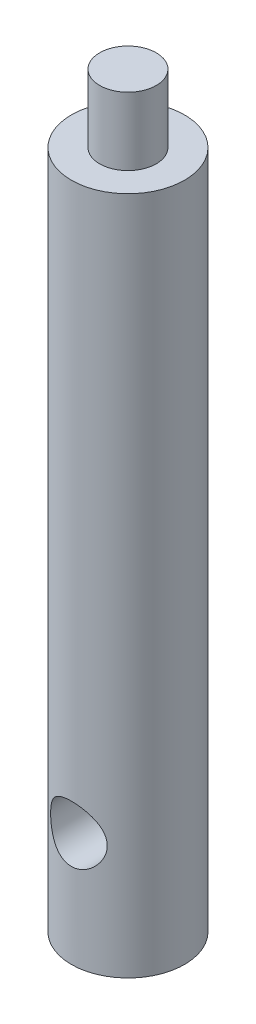
ISO-10303-21;
HEADER;
FILE_DESCRIPTION(('STEP AP214'),'2;1');
FILE_NAME('part.step','',(''),(''),'','','');
FILE_SCHEMA(('AUTOMOTIVE_DESIGN { 1 0 10303 214 1 1 1 1 }'));
ENDSEC;
DATA;
#1=APPLICATION_CONTEXT('core data for automotive mechanical design processes');
#2=APPLICATION_PROTOCOL_DEFINITION('international standard','automotive_design',2000,#1);
#3=PRODUCT_CONTEXT('',#1,'mechanical');
#4=PRODUCT('Part','Part','',(#3));
#5=PRODUCT_RELATED_PRODUCT_CATEGORY('part','',(#4));
#6=PRODUCT_DEFINITION_FORMATION('','',#4);
#7=PRODUCT_DEFINITION_CONTEXT('part definition',#1,'design');
#8=PRODUCT_DEFINITION('design','',#6,#7);
#9=PRODUCT_DEFINITION_SHAPE('','',#8);
#10=(LENGTH_UNIT() NAMED_UNIT(*) SI_UNIT(.MILLI.,.METRE.));
#11=(NAMED_UNIT(*) PLANE_ANGLE_UNIT() SI_UNIT($,.RADIAN.));
#12=(NAMED_UNIT(*) SI_UNIT($,.STERADIAN.) SOLID_ANGLE_UNIT());
#13=UNCERTAINTY_MEASURE_WITH_UNIT(LENGTH_MEASURE(1.E-05),#10,'distance_accuracy_value','');
#14=(GEOMETRIC_REPRESENTATION_CONTEXT(3) GLOBAL_UNCERTAINTY_ASSIGNED_CONTEXT((#13)) GLOBAL_UNIT_ASSIGNED_CONTEXT((#10,
#11,#12)) REPRESENTATION_CONTEXT('',''));
#15=CARTESIAN_POINT('',(0.,0.,0.));
#16=DIRECTION('',(0.,0.,1.));
#17=DIRECTION('',(1.,0.,0.));
#18=AXIS2_PLACEMENT_3D('',#15,#16,#17);
#19=CARTESIAN_POINT('',(0.,66.,0.));
#20=DIRECTION('',(0.,-1.,0.));
#21=DIRECTION('',(0.,0.,-1.));
#22=AXIS2_PLACEMENT_3D('',#19,#20,#21);
#23=PLANE('',#22);
#24=CARTESIAN_POINT('',(0.,66.,0.));
#25=DIRECTION('',(0.,1.,0.));
#26=DIRECTION('',(0.,0.,1.));
#27=AXIS2_PLACEMENT_3D('',#24,#25,#26);
#28=CIRCLE('',#27,2.5);
#29=CARTESIAN_POINT('',(0.,66.,2.5));
#30=VERTEX_POINT('',#29);
#31=EDGE_CURVE('E10',#30,#30,#28,.T.);
#32=ORIENTED_EDGE('',*,*,#31,.T.);
#33=EDGE_LOOP('',(#32));
#34=FACE_BOUND('',#33,.T.);
#35=ADVANCED_FACE('F31',(#34),#23,.F.);
#36=CARTESIAN_POINT('',(0.,51.1748241374195,0.));
#37=DIRECTION('',(0.,1.,0.));
#38=DIRECTION('',(0.,0.,1.));
#39=AXIS2_PLACEMENT_3D('',#36,#37,#38);
#40=CYLINDRICAL_SURFACE('',#39,2.5);
#41=ORIENTED_EDGE('',*,*,#31,.F.);
#42=EDGE_LOOP('',(#41));
#43=FACE_BOUND('',#42,.T.);
#44=CARTESIAN_POINT('',(0.,60.,0.));
#45=DIRECTION('',(0.,1.,0.));
#46=DIRECTION('',(0.,0.,1.));
#47=AXIS2_PLACEMENT_3D('',#44,#45,#46);
#48=CIRCLE('',#47,2.50000000000001);
#49=CARTESIAN_POINT('',(0.,60.,2.50000000000001));
#50=VERTEX_POINT('',#49);
#51=EDGE_CURVE('E42',#50,#50,#48,.T.);
#52=ORIENTED_EDGE('',*,*,#51,.T.);
#53=EDGE_LOOP('',(#52));
#54=FACE_BOUND('',#53,.T.);
#55=ADVANCED_FACE('F73',(#43,#54),#40,.T.);
#56=CARTESIAN_POINT('',(2.50000000000001,60.,0.));
#57=DIRECTION('',(0.,-1.,0.));
#58=DIRECTION('',(0.,0.,-1.));
#59=AXIS2_PLACEMENT_3D('',#56,#57,#58);
#60=PLANE('',#59);
#61=ORIENTED_EDGE('',*,*,#51,.F.);
#62=EDGE_LOOP('',(#61));
#63=FACE_BOUND('',#62,.T.);
#64=CARTESIAN_POINT('',(0.,60.,0.));
#65=DIRECTION('',(0.,1.,0.));
#66=DIRECTION('',(0.,0.,1.));
#67=AXIS2_PLACEMENT_3D('',#64,#65,#66);
#68=CIRCLE('',#67,5.);
#69=CARTESIAN_POINT('',(0.,60.,5.));
#70=VERTEX_POINT('',#69);
#71=EDGE_CURVE('E47',#70,#70,#68,.T.);
#72=ORIENTED_EDGE('',*,*,#71,.T.);
#73=EDGE_LOOP('',(#72));
#74=FACE_BOUND('',#73,.T.);
#75=ADVANCED_FACE('F69',(#63,#74),#60,.F.);
#76=CARTESIAN_POINT('',(0.,51.1748241374195,0.));
#77=DIRECTION('',(0.,1.,0.));
#78=DIRECTION('',(0.,0.,1.));
#79=AXIS2_PLACEMENT_3D('',#76,#77,#78);
#80=CYLINDRICAL_SURFACE('',#79,5.);
#81=CARTESIAN_POINT('',(0.,7.5,5.));
#82=CARTESIAN_POINT('',(-0.131426682334305,7.50000966905601,4.99999177550472));
#83=CARTESIAN_POINT('',(-0.263015634437213,7.51042556177403,4.99476199135278));
#84=CARTESIAN_POINT('',(-0.522301454622883,7.55163182116205,4.9743541856102));
#85=CARTESIAN_POINT('',(-0.649990448564105,7.58246088092502,4.9591572718767));
#86=CARTESIAN_POINT('',(-0.897333631316203,7.66298462271884,4.92040690922477));
#87=CARTESIAN_POINT('',(-1.01701694536277,7.71260598778272,4.89688595907259));
#88=CARTESIAN_POINT('',(-1.24618160399671,7.82892652625179,4.84364443325827));
#89=CARTESIAN_POINT('',(-1.3556637520377,7.89562435314509,4.81392434644421));
#90=CARTESIAN_POINT('',(-1.56876952630998,8.04879313164262,4.74890645050632));
#91=CARTESIAN_POINT('',(-1.67163802294309,8.13621620022978,4.71337997659091));
#92=CARTESIAN_POINT('',(-1.86194861703333,8.32630369598529,4.64149925776731));
#93=CARTESIAN_POINT('',(-1.94937895911555,8.42897962884011,4.60514440566898));
#94=CARTESIAN_POINT('',(-2.11312999967247,8.65620837444528,4.53247377945622));
#95=CARTESIAN_POINT('',(-2.18806333849064,8.781840246035,4.49637967412567));
#96=CARTESIAN_POINT('',(-2.31542056761491,9.04591833979543,4.43214946943555));
#97=CARTESIAN_POINT('',(-2.36786053751683,9.18435532176262,4.40400769020792));
#98=CARTESIAN_POINT('',(-2.44533110537653,9.46166276359641,4.36144667591402));
#99=CARTESIAN_POINT('',(-2.47181464267578,9.60001113017958,4.34630678958452));
#100=CARTESIAN_POINT('',(-2.50106748329741,9.8799470944376,4.3295472487215));
#101=CARTESIAN_POINT('',(-2.50386022093906,10.0215313521751,4.3279142335843));
#102=CARTESIAN_POINT('',(-2.48671821792512,10.2857150607909,4.33777325642937));
#103=CARTESIAN_POINT('',(-2.46946139884055,10.4085600780583,4.34771909154984));
#104=CARTESIAN_POINT('',(-2.41734962264384,10.6493047734319,4.37690571834675));
#105=CARTESIAN_POINT('',(-2.38248905974454,10.7672028632631,4.39614947079454));
#106=CARTESIAN_POINT('',(-2.29552445096459,10.9980728314143,4.44218691031839));
#107=CARTESIAN_POINT('',(-2.24303766778988,11.1108659969645,4.46914601659993));
#108=CARTESIAN_POINT('',(-2.12260421917012,11.326585731475,4.52758510703513));
#109=CARTESIAN_POINT('',(-2.0546506095312,11.4295078390002,4.55906711950478));
#110=CARTESIAN_POINT('',(-1.89516513728194,11.6363031318581,4.62782894758213));
#111=CARTESIAN_POINT('',(-1.8017361459232,11.7386421839404,4.66533775591865));
#112=CARTESIAN_POINT('',(-1.59888894685344,11.9268385464772,4.73869058251019));
#113=CARTESIAN_POINT('',(-1.48946314143572,12.0126879800847,4.77453379897003));
#114=CARTESIAN_POINT('',(-1.25129126457962,12.1692141525743,4.84254968207409));
#115=CARTESIAN_POINT('',(-1.12188397899853,12.2390011811144,4.87447460405015));
#116=CARTESIAN_POINT('',(-0.851165538721987,12.3552425726075,4.92894702803109));
#117=CARTESIAN_POINT('',(-0.709863940663163,12.4017154625379,4.95150197358894));
#118=CARTESIAN_POINT('',(-0.431916229151781,12.4661885092917,4.98310834353579));
#119=CARTESIAN_POINT('',(-0.295853826370907,12.486228089367,4.9931234575324));
#120=CARTESIAN_POINT('',(-0.021948999873289,12.5036618278362,5.00182533647794));
#121=CARTESIAN_POINT('',(0.115892549675108,12.5010667140985,5.00051746803426));
#122=CARTESIAN_POINT('',(0.378082429964656,12.4744832789533,4.98727980633468));
#123=CARTESIAN_POINT('',(0.502648520123706,12.4521686681756,4.97618114219993));
#124=CARTESIAN_POINT('',(0.746017230755971,12.3894048202616,4.94555428287529));
#125=CARTESIAN_POINT('',(0.864819214231883,12.3489535838641,4.92602515837625));
#126=CARTESIAN_POINT('',(1.09722152111965,12.2500038339196,4.87960628532329));
#127=CARTESIAN_POINT('',(1.21057599249831,12.1910223747177,4.85252204417873));
#128=CARTESIAN_POINT('',(1.42615340426439,12.0572311608752,4.79359935799751));
#129=CARTESIAN_POINT('',(1.52837157450204,11.9824146634801,4.76175888940534));
#130=CARTESIAN_POINT('',(1.72941922315487,11.8105989367091,4.69270553315087));
#131=CARTESIAN_POINT('',(1.82693019428496,11.7121428290248,4.65527212009488));
#132=CARTESIAN_POINT('',(2.0046408025722,11.5001871219506,4.58155978921587));
#133=CARTESIAN_POINT('',(2.08482846428685,11.3866772029301,4.54528168472407));
#134=CARTESIAN_POINT('',(2.22926978618995,11.1408908645153,4.4762798054528));
#135=CARTESIAN_POINT('',(2.29256373922243,11.0079718347089,4.44381323981254));
#136=CARTESIAN_POINT('',(2.39520706511459,10.7312248311174,4.38935180726746));
#137=CARTESIAN_POINT('',(2.43458729077056,10.587411184,4.36734345549014));
#138=CARTESIAN_POINT('',(2.48465421767005,10.3077244426371,4.33903752569351));
#139=CARTESIAN_POINT('',(2.4977324874436,10.172414365881,4.33143458674096));
#140=CARTESIAN_POINT('',(2.50172288950898,9.90138233261932,4.32913386592579));
#141=CARTESIAN_POINT('',(2.49264462983266,9.76566058012637,4.33443049025111));
#142=CARTESIAN_POINT('',(2.45481530197332,9.51129124438315,4.35594655164663));
#143=CARTESIAN_POINT('',(2.42802074302696,9.39224881827923,4.37107736338133));
#144=CARTESIAN_POINT('',(2.35793843840544,9.16047970780004,4.40927540337603));
#145=CARTESIAN_POINT('',(2.31464538728732,9.04775506843346,4.43234518434965));
#146=CARTESIAN_POINT('',(2.20953919315538,8.82343784728027,4.48571326433413));
#147=CARTESIAN_POINT('',(2.14667719009404,8.71243014826498,4.5163930799845));
#148=CARTESIAN_POINT('',(2.0053780838799,8.50181375675995,4.58088327077455));
#149=CARTESIAN_POINT('',(1.92693287765888,8.40221103737127,4.61469526970767));
#150=CARTESIAN_POINT('',(1.74550556946066,8.20464463625036,4.68655816327011));
#151=CARTESIAN_POINT('',(1.6407002246921,8.10835063582862,4.72462491514981));
#152=CARTESIAN_POINT('',(1.41539785420684,7.93434415057195,4.79694347383545));
#153=CARTESIAN_POINT('',(1.29489242426332,7.85664168139412,4.83119321905446));
#154=CARTESIAN_POINT('',(1.03978808878536,7.7219030205159,4.89245149457782));
#155=CARTESIAN_POINT('',(0.905095560782288,7.66501683221555,4.91940711437488));
#156=CARTESIAN_POINT('',(0.696328709257352,7.5978161412076,4.95177960923351));
#157=CARTESIAN_POINT('',(0.625670413494089,7.57844460199819,4.96122314081874));
#158=CARTESIAN_POINT('',(0.482623997839258,7.5459340516294,4.97717127275101));
#159=CARTESIAN_POINT('',(0.410236963092401,7.53279123332365,4.98367766823159));
#160=CARTESIAN_POINT('',(0.281518684621671,7.51526252771536,4.9923820076613));
#161=CARTESIAN_POINT('',(0.225408499555444,7.50954506346867,4.99523288466454));
#162=CARTESIAN_POINT('',(0.112875528456288,7.50191167053429,4.99904367329659));
#163=CARTESIAN_POINT('',(0.0564527338382177,7.49999584677452,5.00000353273198));
#164=CARTESIAN_POINT('',(0.,7.5,5.));
#165=B_SPLINE_CURVE_WITH_KNOTS('',3,(#81,#82,#83,#84,#85,#86,#87,#88,#89,#90,#91,#92,#93,#94,
#95,#96,#97,#98,#99,#100,#101,#102,#103,#104,#105,#106,#107,#108,#109,#110,#111,#112,#113,#114,
#115,#116,#117,#118,#119,#120,#121,#122,#123,#124,#125,#126,#127,#128,#129,#130,#131,#132,#133,
#134,#135,#136,#137,#138,#139,#140,#141,#142,#143,#144,#145,#146,#147,#148,#149,#150,#151,#152,
#153,#154,#155,#156,#157,#158,#159,#160,#161,#162,#163,#164),.UNSPECIFIED.,.T.,.F.,(4,2,2,2,2,2,
2,2,2,2,2,2,2,2,2,2,2,2,2,2,2,2,2,2,2,2,2,2,2,2,2,2,2,2,2,2,2,2,2,2,2,4),(0.,0.394060643550732,
0.788870374272994,1.18215538873075,1.57540940145392,1.99245439679522,2.40981559413509,
2.85954316076882,3.30894869745703,3.73145030350574,4.15353393322551,4.52514281023302,
4.89687009814196,5.27725600421219,5.65781303150555,6.08662353334696,6.51563836496716,
6.96457555536102,7.41315542280699,7.82458226178364,8.2358141127869,8.61517266265305,
8.99457304077329,9.38482140069747,9.77523626870849,10.2039902661037,10.6330397153795,
11.0828670540368,11.53211279863,11.9382326875699,12.3441764966107,12.7114482562151,
13.0788382197025,13.4709114195009,13.8631890285845,14.303131068923,14.7433095845248,
15.1866003415819,15.407934939208,15.6291340766843,15.7983933645035,15.9676573239323),.UNSPECIFIED.);
#166=CARTESIAN_POINT('',(0.,7.5,5.));
#167=VERTEX_POINT('',#166);
#168=EDGE_CURVE('E34',#167,#167,#165,.T.);
#169=ORIENTED_EDGE('',*,*,#168,.T.);
#170=EDGE_LOOP('',(#169));
#171=FACE_BOUND('',#170,.T.);
#172=CARTESIAN_POINT('',(2.5,10.,-4.33012701892219));
#173=CARTESIAN_POINT('',(2.49998948436432,10.1302665068765,-4.33013982272992));
#174=CARTESIAN_POINT('',(2.48974954513168,10.2607027206762,-4.33609541965583));
#175=CARTESIAN_POINT('',(2.44930840724944,10.5175689715292,-4.35905877051907));
#176=CARTESIAN_POINT('',(2.41906526369545,10.6439900040573,-4.37608974726023));
#177=CARTESIAN_POINT('',(2.3402497699757,10.8886289455611,-4.41873376871659));
#178=CARTESIAN_POINT('',(2.29177485369963,11.0068865735622,-4.44430111338921));
#179=CARTESIAN_POINT('',(2.17816884056414,11.2335605630945,-4.50106659111456));
#180=CARTESIAN_POINT('',(2.11303684262671,11.3419763917958,-4.53226502875883));
#181=CARTESIAN_POINT('',(1.96166634317253,11.5557643039169,-4.59992173524851));
#182=CARTESIAN_POINT('',(1.87413008816917,11.6601478344898,-4.63660159331578));
#183=CARTESIAN_POINT('',(1.68313452122752,11.8535209757132,-4.70929956727453));
#184=CARTESIAN_POINT('',(1.57966731506052,11.9425029077549,-4.74531734512768));
#185=CARTESIAN_POINT('',(1.35122390789082,12.1084178764856,-4.81553692452135));
#186=CARTESIAN_POINT('',(1.22526797235894,12.1841344192791,-4.84945266064072));
#187=CARTESIAN_POINT('',(0.960392566671148,12.3128521334839,-4.90876890230193));
#188=CARTESIAN_POINT('',(0.821481345389984,12.3658676404385,-4.93417477954535));
#189=CARTESIAN_POINT('',(0.545112359773523,12.443761653164,-4.9720115311507));
#190=CARTESIAN_POINT('',(0.408254476210983,12.4703738158651,-4.98523700553425));
#191=CARTESIAN_POINT('',(0.131426571755677,12.5004152967113,-5.00018959613973));
#192=CARTESIAN_POINT('',(-0.0085415146065083,12.5038586419954,-5.00192366961168));
#193=CARTESIAN_POINT('',(-0.274581311061964,12.4881333150686,-4.99407454791405));
#194=CARTESIAN_POINT('',(-0.400802997942673,12.4709049611955,-4.98546239730476));
#195=CARTESIAN_POINT('',(-0.64828442979511,12.4177978902398,-4.95935613149294));
#196=CARTESIAN_POINT('',(-0.769543802734626,12.3819177775598,-4.94186135165964));
#197=CARTESIAN_POINT('',(-1.00577347892407,12.2922935847751,-4.89928958219157));
#198=CARTESIAN_POINT('',(-1.120633558788,12.2383092170697,-4.87411103823003));
#199=CARTESIAN_POINT('',(-1.33994200378327,12.1143414594964,-4.81844114966713));
#200=CARTESIAN_POINT('',(-1.4443866220966,12.0443523417442,-4.78794790393709));
#201=CARTESIAN_POINT('',(-1.6504341522455,11.8827616211674,-4.72110985998075));
#202=CARTESIAN_POINT('',(-1.75083518757341,11.789742429185,-4.68448439995438));
#203=CARTESIAN_POINT('',(-1.93526092574445,11.5885256876746,-4.61135851467029));
#204=CARTESIAN_POINT('',(-2.01927302893558,11.4803165693148,-4.57485820664072));
#205=CARTESIAN_POINT('',(-2.17376333660553,11.2433795189398,-4.50360390231212));
#206=CARTESIAN_POINT('',(-2.24304328744513,11.1137849423645,-4.46910799976769));
#207=CARTESIAN_POINT('',(-2.35829778250308,10.8426558216025,-4.4093862569644));
#208=CARTESIAN_POINT('',(-2.40429664552723,10.7011339174561,-4.38415075115168));
#209=CARTESIAN_POINT('',(-2.4679505275626,10.421963721793,-4.34861589542586));
#210=CARTESIAN_POINT('',(-2.48756280529994,10.2848972023911,-4.33729139621241));
#211=CARTESIAN_POINT('',(-2.50379236652857,10.0089966462086,-4.32794798404024));
#212=CARTESIAN_POINT('',(-2.50042589328757,9.8701639272005,-4.32991967223279));
#213=CARTESIAN_POINT('',(-2.47259010835991,9.6108652035532,-4.34585841351462));
#214=CARTESIAN_POINT('',(-2.45046954178116,9.49005137223027,-4.35848968766635));
#215=CARTESIAN_POINT('',(-2.38924071158112,9.25408053432252,-4.39235053878353));
#216=CARTESIAN_POINT('',(-2.35012694655908,9.13892537313315,-4.41358290012585));
#217=CARTESIAN_POINT('',(-2.25411897151217,8.91147167274361,-4.46340555199141));
#218=CARTESIAN_POINT('',(-2.19648515923163,8.79955245786744,-4.49229108107657));
#219=CARTESIAN_POINT('',(-2.0657176600397,8.5863268211512,-4.55390298743125));
#220=CARTESIAN_POINT('',(-1.99257601083123,8.48502589121186,-4.58663133387872));
#221=CARTESIAN_POINT('',(-1.82209291799636,8.28255308119668,-4.65719996140836));
#222=CARTESIAN_POINT('',(-1.72286318078435,8.18300712322778,-4.69516457885708));
#223=CARTESIAN_POINT('',(-1.5085112384988,8.00146940499409,-4.76835587444746));
#224=CARTESIAN_POINT('',(-1.39338368664989,7.91948357434145,-4.80358162519329));
#225=CARTESIAN_POINT('',(-1.14633840638508,7.77356568520911,-4.86853404227335));
#226=CARTESIAN_POINT('',(-1.01405774389062,7.71016720479154,-4.89809104179855));
#227=CARTESIAN_POINT('',(-0.738805911647333,7.60715524003798,-4.9470838739847));
#228=CARTESIAN_POINT('',(-0.595844253647068,7.56752087039488,-4.96652859191746));
#229=CARTESIAN_POINT('',(-0.317449205674708,7.51657859064358,-4.99168770453968));
#230=CARTESIAN_POINT('',(-0.182528609085378,7.50300531416965,-4.99849819767838));
#231=CARTESIAN_POINT('',(0.0878149643374291,7.4978918325054,-5.00105325940467));
#232=CARTESIAN_POINT('',(0.223237748727015,7.50634391433891,-4.99680170177042));
#233=CARTESIAN_POINT('',(0.481344982671071,7.5435410303955,-4.97834922085637));
#234=CARTESIAN_POINT('',(0.604280801321771,7.57091217163631,-4.96482236636807));
#235=CARTESIAN_POINT('',(0.843614873664453,7.64331744975833,-4.92980234191731));
#236=CARTESIAN_POINT('',(0.960012187087212,7.68835411963363,-4.90830802955518));
#237=CARTESIAN_POINT('',(1.18855854199593,7.79681781873926,-4.85814826741488));
#238=CARTESIAN_POINT('',(1.30031295715362,7.86094902468984,-4.82921542506803));
#239=CARTESIAN_POINT('',(1.51193650408535,8.00489411014759,-4.76720333344986));
#240=CARTESIAN_POINT('',(1.61180014305397,8.08471519262686,-4.73412218229105));
#241=CARTESIAN_POINT('',(1.80728542324369,8.26699579444936,-4.66321523550925));
#242=CARTESIAN_POINT('',(1.90149582349002,8.37091772600073,-4.62524489658367));
#243=CARTESIAN_POINT('',(2.07165660492503,8.59361528538223,-4.55157698284941));
#244=CARTESIAN_POINT('',(2.1475908315154,8.71240391419923,-4.51588143910585));
#245=CARTESIAN_POINT('',(2.28108393396028,8.96663611766425,-4.44998982823926));
#246=CARTESIAN_POINT('',(2.3379862797745,9.1024873884246,-4.42000320346984));
#247=CARTESIAN_POINT('',(2.40494911880459,9.31322264951977,-4.38370272660094));
#248=CARTESIAN_POINT('',(2.42419582683991,9.38455977569761,-4.37305486646054));
#249=CARTESIAN_POINT('',(2.45635087255789,9.52904069684933,-4.35507574170935));
#250=CARTESIAN_POINT('',(2.46926364179177,9.60218319095441,-4.34774215854234));
#251=CARTESIAN_POINT('',(2.48591166201423,9.72950098654694,-4.33823779542921));
#252=CARTESIAN_POINT('',(2.49118864979202,9.78341632151221,-4.33520487024791));
#253=CARTESIAN_POINT('',(2.49823512543934,9.89154461631041,-4.33114674911323));
#254=CARTESIAN_POINT('',(2.50000437866475,9.94575759581055,-4.33012168747261));
#255=CARTESIAN_POINT('',(2.5,10.,-4.33012701892219));
#256=B_SPLINE_CURVE_WITH_KNOTS('',3,(#172,#173,#174,#175,#176,#177,#178,#179,#180,#181,#182,
#183,#184,#185,#186,#187,#188,#189,#190,#191,#192,#193,#194,#195,#196,#197,#198,#199,#200,#201,
#202,#203,#204,#205,#206,#207,#208,#209,#210,#211,#212,#213,#214,#215,#216,#217,#218,#219,#220,
#221,#222,#223,#224,#225,#226,#227,#228,#229,#230,#231,#232,#233,#234,#235,#236,#237,#238,#239,
#240,#241,#242,#243,#244,#245,#246,#247,#248,#249,#250,#251,#252,#253,#254,#255),.UNSPECIFIED.,
.T.,.F.,(4,2,2,2,2,2,2,2,2,2,2,2,2,2,2,2,2,2,2,2,2,2,2,2,2,2,2,2,2,2,2,2,2,2,2,2,2,2,2,2,2,4),
(0.,0.39058030648679,0.781982232062012,1.17132148982692,1.56068181366371,1.98215578129642,
2.40383927716011,2.85394730601992,3.30377067414811,3.72158712424921,4.13915059220183,
4.52040243716429,4.90168281298721,5.2882383683295,5.67493248380763,6.0981797864731,
6.5217512061988,6.97222104328705,7.42221935534346,7.83655727140613,8.25060232976016,
8.61935458565147,8.98822631095241,9.37418241020303,9.76033715555202,10.1951685895662,
10.6301466245059,11.076604535375,11.5226694952701,11.927806759788,12.3328021699001,
12.7111106218382,13.0894733378512,13.4840187680376,13.8787457525688,14.3127560463025,
14.7471485711797,15.195268726016,15.4189244153949,15.6424233996907,15.8050484542806,
15.9676843870379),.UNSPECIFIED.);
#257=CARTESIAN_POINT('',(2.5,10.,-4.33012701892219));
#258=VERTEX_POINT('',#257);
#259=EDGE_CURVE('E50',#258,#258,#256,.T.);
#260=ORIENTED_EDGE('',*,*,#259,.T.);
#261=EDGE_LOOP('',(#260));
#262=FACE_BOUND('',#261,.T.);
#263=ORIENTED_EDGE('',*,*,#71,.F.);
#264=EDGE_LOOP('',(#263));
#265=FACE_BOUND('',#264,.T.);
#266=CARTESIAN_POINT('',(0.,0.,0.));
#267=DIRECTION('',(0.,1.,0.));
#268=DIRECTION('',(0.,0.,1.));
#269=AXIS2_PLACEMENT_3D('',#266,#267,#268);
#270=CIRCLE('',#269,5.);
#271=CARTESIAN_POINT('',(0.,0.,5.));
#272=VERTEX_POINT('',#271);
#273=EDGE_CURVE('E88',#272,#272,#270,.T.);
#274=ORIENTED_EDGE('',*,*,#273,.T.);
#275=EDGE_LOOP('',(#274));
#276=FACE_BOUND('',#275,.T.);
#277=ADVANCED_FACE('F54',(#171,#262,#265,#276),#80,.T.);
#278=CARTESIAN_POINT('',(5.,0.,0.));
#279=DIRECTION('',(0.,1.,0.));
#280=DIRECTION('',(0.,0.,1.));
#281=AXIS2_PLACEMENT_3D('',#278,#279,#280);
#282=PLANE('',#281);
#283=ORIENTED_EDGE('',*,*,#273,.F.);
#284=EDGE_LOOP('',(#283));
#285=FACE_BOUND('',#284,.T.);
#286=ADVANCED_FACE('F61',(#285),#282,.F.);
#287=CARTESIAN_POINT('',(0.,10.,-10.));
#288=DIRECTION('',(0.,0.,1.));
#289=DIRECTION('',(1.,0.,0.));
#290=AXIS2_PLACEMENT_3D('',#287,#288,#289);
#291=CYLINDRICAL_SURFACE('',#290,2.5);
#292=ORIENTED_EDGE('',*,*,#259,.F.);
#293=EDGE_LOOP('',(#292));
#294=FACE_BOUND('',#293,.T.);
#295=ORIENTED_EDGE('',*,*,#168,.F.);
#296=EDGE_LOOP('',(#295));
#297=FACE_BOUND('',#296,.T.);
#298=ADVANCED_FACE('F58',(#294,#297),#291,.F.);
#299=CLOSED_SHELL('',(#35,#55,#75,#277,#286,#298));
#300=MANIFOLD_SOLID_BREP('B2',#299);
#301=ADVANCED_BREP_SHAPE_REPRESENTATION('',(#18,#300),#14);
#302=SHAPE_DEFINITION_REPRESENTATION(#9,#301);
ENDSEC;
END-ISO-10303-21;
